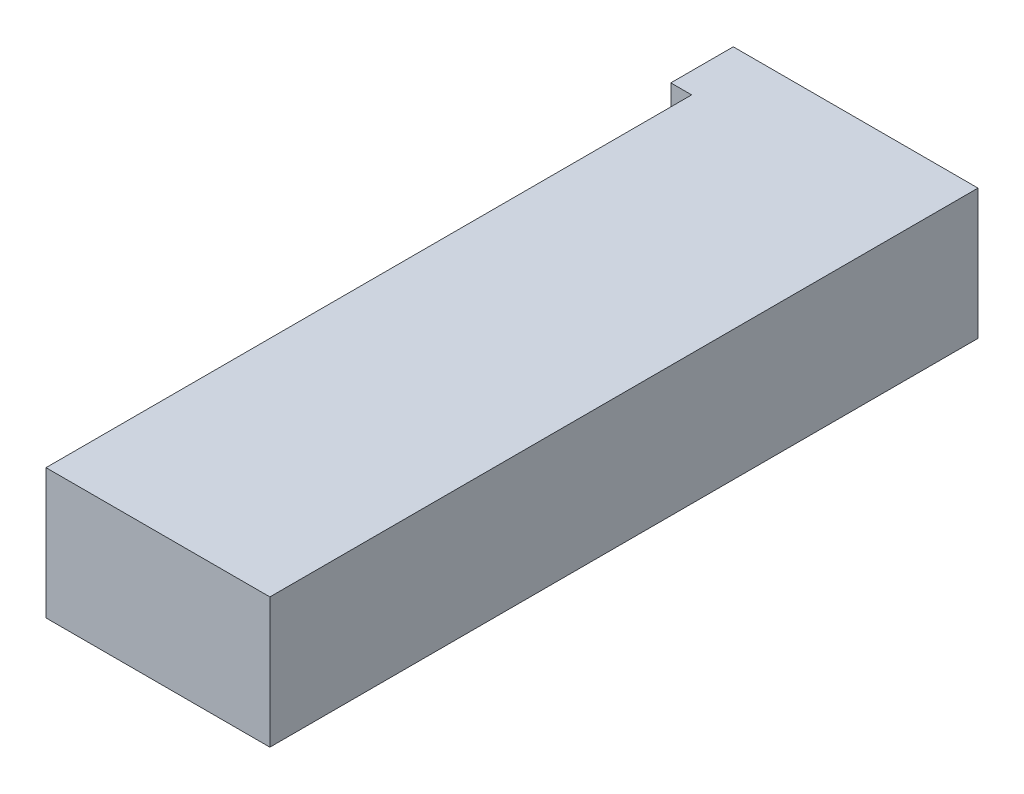
ISO-10303-21;
HEADER;
FILE_DESCRIPTION(('STEP AP214'),'2;1');
FILE_NAME('part.step','',(''),(''),'','','');
FILE_SCHEMA(('AUTOMOTIVE_DESIGN { 1 0 10303 214 1 1 1 1 }'));
ENDSEC;
DATA;
#1=APPLICATION_CONTEXT('core data for automotive mechanical design processes');
#2=APPLICATION_PROTOCOL_DEFINITION('international standard','automotive_design',2000,#1);
#3=PRODUCT_CONTEXT('',#1,'mechanical');
#4=PRODUCT('Part','Part','',(#3));
#5=PRODUCT_RELATED_PRODUCT_CATEGORY('part','',(#4));
#6=PRODUCT_DEFINITION_FORMATION('','',#4);
#7=PRODUCT_DEFINITION_CONTEXT('part definition',#1,'design');
#8=PRODUCT_DEFINITION('design','',#6,#7);
#9=PRODUCT_DEFINITION_SHAPE('','',#8);
#10=(LENGTH_UNIT() NAMED_UNIT(*) SI_UNIT(.MILLI.,.METRE.));
#11=(NAMED_UNIT(*) PLANE_ANGLE_UNIT() SI_UNIT($,.RADIAN.));
#12=(NAMED_UNIT(*) SI_UNIT($,.STERADIAN.) SOLID_ANGLE_UNIT());
#13=UNCERTAINTY_MEASURE_WITH_UNIT(LENGTH_MEASURE(1.E-05),#10,'distance_accuracy_value','');
#14=(GEOMETRIC_REPRESENTATION_CONTEXT(3) GLOBAL_UNCERTAINTY_ASSIGNED_CONTEXT((#13)) GLOBAL_UNIT_ASSIGNED_CONTEXT((#10,
#11,#12)) REPRESENTATION_CONTEXT('',''));
#15=CARTESIAN_POINT('',(0.,0.,0.));
#16=DIRECTION('',(0.,0.,1.));
#17=DIRECTION('',(1.,0.,0.));
#18=AXIS2_PLACEMENT_3D('',#15,#16,#17);
#19=CARTESIAN_POINT('',(0.,25.,-68.));
#20=DIRECTION('',(0.,0.,-1.));
#21=DIRECTION('',(-1.,0.,0.));
#22=AXIS2_PLACEMENT_3D('',#19,#20,#21);
#23=PLANE('',#22);
#24=DIRECTION('',(1.,0.,0.));
#25=VECTOR('',#24,1.);
#26=CARTESIAN_POINT('',(0.,0.,-68.));
#27=LINE('',#26,#25);
#28=CARTESIAN_POINT('',(-25.5,0.,-68.));
#29=VERTEX_POINT('',#28);
#30=CARTESIAN_POINT('',(21.5,0.,-68.));
#31=VERTEX_POINT('',#30);
#32=EDGE_CURVE('E128',#29,#31,#27,.T.);
#33=ORIENTED_EDGE('',*,*,#32,.F.);
#34=DIRECTION('',(0.,-1.,0.));
#35=VECTOR('',#34,1.);
#36=CARTESIAN_POINT('',(-25.5,25.,-68.));
#37=LINE('',#36,#35);
#38=CARTESIAN_POINT('',(-25.5,25.,-68.));
#39=VERTEX_POINT('',#38);
#40=EDGE_CURVE('E11',#39,#29,#37,.T.);
#41=ORIENTED_EDGE('',*,*,#40,.F.);
#42=DIRECTION('',(1.,0.,0.));
#43=VECTOR('',#42,1.);
#44=CARTESIAN_POINT('',(0.,25.,-68.));
#45=LINE('',#44,#43);
#46=CARTESIAN_POINT('',(21.5,25.,-68.));
#47=VERTEX_POINT('',#46);
#48=EDGE_CURVE('E146',#39,#47,#45,.T.);
#49=ORIENTED_EDGE('',*,*,#48,.T.);
#50=DIRECTION('',(0.,-1.,0.));
#51=VECTOR('',#50,1.);
#52=CARTESIAN_POINT('',(21.5,25.,-68.));
#53=LINE('',#52,#51);
#54=EDGE_CURVE('E58',#47,#31,#53,.T.);
#55=ORIENTED_EDGE('',*,*,#54,.T.);
#56=EDGE_LOOP('',(#33,#41,#49,#55));
#57=FACE_BOUND('',#56,.T.);
#58=ADVANCED_FACE('F41',(#57),#23,.T.);
#59=CARTESIAN_POINT('',(-25.5,25.,0.));
#60=DIRECTION('',(1.,0.,0.));
#61=DIRECTION('',(0.,0.,-1.));
#62=AXIS2_PLACEMENT_3D('',#59,#60,#61);
#63=PLANE('',#62);
#64=DIRECTION('',(0.,0.,1.));
#65=VECTOR('',#64,1.);
#66=CARTESIAN_POINT('',(-25.5,0.,0.));
#67=LINE('',#66,#65);
#68=CARTESIAN_POINT('',(-25.5,0.,-56.));
#69=VERTEX_POINT('',#68);
#70=EDGE_CURVE('E131',#29,#69,#67,.T.);
#71=ORIENTED_EDGE('',*,*,#70,.T.);
#72=DIRECTION('',(0.,-1.,0.));
#73=VECTOR('',#72,1.);
#74=CARTESIAN_POINT('',(-25.5,25.,-56.));
#75=LINE('',#74,#73);
#76=CARTESIAN_POINT('',(-25.5,25.,-56.));
#77=VERTEX_POINT('',#76);
#78=EDGE_CURVE('E50',#77,#69,#75,.T.);
#79=ORIENTED_EDGE('',*,*,#78,.F.);
#80=DIRECTION('',(0.,0.,1.));
#81=VECTOR('',#80,1.);
#82=CARTESIAN_POINT('',(-25.5,25.,0.));
#83=LINE('',#82,#81);
#84=EDGE_CURVE('E244',#39,#77,#83,.T.);
#85=ORIENTED_EDGE('',*,*,#84,.F.);
#86=ORIENTED_EDGE('',*,*,#40,.T.);
#87=EDGE_LOOP('',(#71,#79,#85,#86));
#88=FACE_BOUND('',#87,.T.);
#89=ADVANCED_FACE('F173',(#88),#63,.F.);
#90=CARTESIAN_POINT('',(0.,25.,-56.));
#91=DIRECTION('',(0.,0.,-1.));
#92=DIRECTION('',(-1.,0.,0.));
#93=AXIS2_PLACEMENT_3D('',#90,#91,#92);
#94=PLANE('',#93);
#95=DIRECTION('',(1.,0.,0.));
#96=VECTOR('',#95,1.);
#97=CARTESIAN_POINT('',(0.,0.,-56.));
#98=LINE('',#97,#96);
#99=CARTESIAN_POINT('',(-21.5,0.,-56.));
#100=VERTEX_POINT('',#99);
#101=EDGE_CURVE('E134',#69,#100,#98,.T.);
#102=ORIENTED_EDGE('',*,*,#101,.T.);
#103=DIRECTION('',(0.,-1.,0.));
#104=VECTOR('',#103,1.);
#105=CARTESIAN_POINT('',(-21.5,25.,-56.));
#106=LINE('',#105,#104);
#107=CARTESIAN_POINT('',(-21.5,25.,-56.));
#108=VERTEX_POINT('',#107);
#109=EDGE_CURVE('E118',#108,#100,#106,.T.);
#110=ORIENTED_EDGE('',*,*,#109,.F.);
#111=DIRECTION('',(1.,0.,0.));
#112=VECTOR('',#111,1.);
#113=CARTESIAN_POINT('',(0.,25.,-56.));
#114=LINE('',#113,#112);
#115=EDGE_CURVE('E104',#77,#108,#114,.T.);
#116=ORIENTED_EDGE('',*,*,#115,.F.);
#117=ORIENTED_EDGE('',*,*,#78,.T.);
#118=EDGE_LOOP('',(#102,#110,#116,#117));
#119=FACE_BOUND('',#118,.T.);
#120=ADVANCED_FACE('F157',(#119),#94,.F.);
#121=CARTESIAN_POINT('',(-21.5,25.,0.));
#122=DIRECTION('',(1.,0.,0.));
#123=DIRECTION('',(0.,0.,-1.));
#124=AXIS2_PLACEMENT_3D('',#121,#122,#123);
#125=PLANE('',#124);
#126=DIRECTION('',(0.,0.,1.));
#127=VECTOR('',#126,1.);
#128=CARTESIAN_POINT('',(-21.5,0.,0.));
#129=LINE('',#128,#127);
#130=CARTESIAN_POINT('',(-21.5,0.,68.));
#131=VERTEX_POINT('',#130);
#132=EDGE_CURVE('E114',#100,#131,#129,.T.);
#133=ORIENTED_EDGE('',*,*,#132,.T.);
#134=DIRECTION('',(0.,-1.,0.));
#135=VECTOR('',#134,1.);
#136=CARTESIAN_POINT('',(-21.5,25.,68.));
#137=LINE('',#136,#135);
#138=CARTESIAN_POINT('',(-21.5,25.,68.));
#139=VERTEX_POINT('',#138);
#140=EDGE_CURVE('E111',#139,#131,#137,.T.);
#141=ORIENTED_EDGE('',*,*,#140,.F.);
#142=DIRECTION('',(0.,0.,1.));
#143=VECTOR('',#142,1.);
#144=CARTESIAN_POINT('',(-21.5,25.,0.));
#145=LINE('',#144,#143);
#146=EDGE_CURVE('E96',#108,#139,#145,.T.);
#147=ORIENTED_EDGE('',*,*,#146,.F.);
#148=ORIENTED_EDGE('',*,*,#109,.T.);
#149=EDGE_LOOP('',(#133,#141,#147,#148));
#150=FACE_BOUND('',#149,.T.);
#151=ADVANCED_FACE('F112',(#150),#125,.F.);
#152=CARTESIAN_POINT('',(0.,25.,68.));
#153=DIRECTION('',(0.,0.,-1.));
#154=DIRECTION('',(-1.,0.,0.));
#155=AXIS2_PLACEMENT_3D('',#152,#153,#154);
#156=PLANE('',#155);
#157=DIRECTION('',(1.,0.,0.));
#158=VECTOR('',#157,1.);
#159=CARTESIAN_POINT('',(0.,0.,68.));
#160=LINE('',#159,#158);
#161=CARTESIAN_POINT('',(21.5,0.,68.));
#162=VERTEX_POINT('',#161);
#163=EDGE_CURVE('E139',#131,#162,#160,.T.);
#164=ORIENTED_EDGE('',*,*,#163,.T.);
#165=DIRECTION('',(0.,-1.,0.));
#166=VECTOR('',#165,1.);
#167=CARTESIAN_POINT('',(21.5,25.,68.));
#168=LINE('',#167,#166);
#169=CARTESIAN_POINT('',(21.5,25.,68.));
#170=VERTEX_POINT('',#169);
#171=EDGE_CURVE('E78',#170,#162,#168,.T.);
#172=ORIENTED_EDGE('',*,*,#171,.F.);
#173=DIRECTION('',(1.,0.,0.));
#174=VECTOR('',#173,1.);
#175=CARTESIAN_POINT('',(0.,25.,68.));
#176=LINE('',#175,#174);
#177=EDGE_CURVE('E102',#139,#170,#176,.T.);
#178=ORIENTED_EDGE('',*,*,#177,.F.);
#179=ORIENTED_EDGE('',*,*,#140,.T.);
#180=EDGE_LOOP('',(#164,#172,#178,#179));
#181=FACE_BOUND('',#180,.T.);
#182=ADVANCED_FACE('F120',(#181),#156,.F.);
#183=CARTESIAN_POINT('',(21.5,25.,0.));
#184=DIRECTION('',(1.,0.,0.));
#185=DIRECTION('',(0.,0.,-1.));
#186=AXIS2_PLACEMENT_3D('',#183,#184,#185);
#187=PLANE('',#186);
#188=DIRECTION('',(0.,0.,1.));
#189=VECTOR('',#188,1.);
#190=CARTESIAN_POINT('',(21.5,0.,0.));
#191=LINE('',#190,#189);
#192=EDGE_CURVE('E142',#31,#162,#191,.T.);
#193=ORIENTED_EDGE('',*,*,#192,.F.);
#194=ORIENTED_EDGE('',*,*,#54,.F.);
#195=DIRECTION('',(0.,0.,1.));
#196=VECTOR('',#195,1.);
#197=CARTESIAN_POINT('',(21.5,25.,0.));
#198=LINE('',#197,#196);
#199=EDGE_CURVE('E122',#47,#170,#198,.T.);
#200=ORIENTED_EDGE('',*,*,#199,.T.);
#201=ORIENTED_EDGE('',*,*,#171,.T.);
#202=EDGE_LOOP('',(#193,#194,#200,#201));
#203=FACE_BOUND('',#202,.T.);
#204=ADVANCED_FACE('F162',(#203),#187,.T.);
#205=CARTESIAN_POINT('',(0.,25.,0.));
#206=DIRECTION('',(0.,1.,0.));
#207=DIRECTION('',(0.,0.,1.));
#208=AXIS2_PLACEMENT_3D('',#205,#206,#207);
#209=PLANE('',#208);
#210=ORIENTED_EDGE('',*,*,#48,.F.);
#211=ORIENTED_EDGE('',*,*,#84,.T.);
#212=ORIENTED_EDGE('',*,*,#115,.T.);
#213=ORIENTED_EDGE('',*,*,#146,.T.);
#214=ORIENTED_EDGE('',*,*,#177,.T.);
#215=ORIENTED_EDGE('',*,*,#199,.F.);
#216=EDGE_LOOP('',(#210,#211,#212,#213,#214,#215));
#217=FACE_BOUND('',#216,.T.);
#218=ADVANCED_FACE('F99',(#217),#209,.T.);
#219=CARTESIAN_POINT('',(0.,0.,0.));
#220=DIRECTION('',(0.,1.,0.));
#221=DIRECTION('',(0.,0.,1.));
#222=AXIS2_PLACEMENT_3D('',#219,#220,#221);
#223=PLANE('',#222);
#224=ORIENTED_EDGE('',*,*,#32,.T.);
#225=ORIENTED_EDGE('',*,*,#192,.T.);
#226=ORIENTED_EDGE('',*,*,#163,.F.);
#227=ORIENTED_EDGE('',*,*,#132,.F.);
#228=ORIENTED_EDGE('',*,*,#101,.F.);
#229=ORIENTED_EDGE('',*,*,#70,.F.);
#230=EDGE_LOOP('',(#224,#225,#226,#227,#228,#229));
#231=FACE_BOUND('',#230,.T.);
#232=ADVANCED_FACE('F161',(#231),#223,.F.);
#233=CLOSED_SHELL('',(#58,#89,#120,#151,#182,#204,#218,#232));
#234=MANIFOLD_SOLID_BREP('B2',#233);
#235=ADVANCED_BREP_SHAPE_REPRESENTATION('',(#18,#234),#14);
#236=SHAPE_DEFINITION_REPRESENTATION(#9,#235);
ENDSEC;
END-ISO-10303-21;
